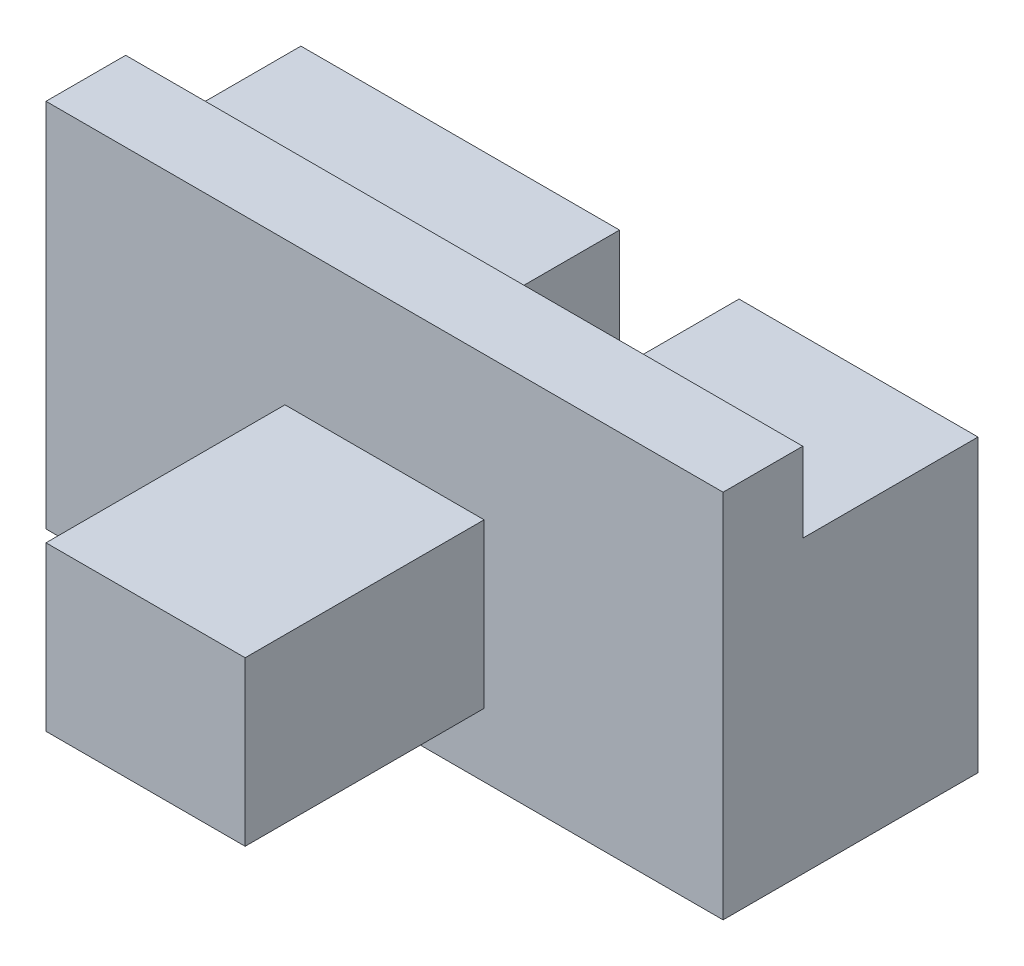
ISO-10303-21;
HEADER;
FILE_DESCRIPTION(('STEP AP214'),'2;1');
FILE_NAME('part.step','',(''),(''),'','','');
FILE_SCHEMA(('AUTOMOTIVE_DESIGN { 1 0 10303 214 1 1 1 1 }'));
ENDSEC;
DATA;
#1=APPLICATION_CONTEXT('core data for automotive mechanical design processes');
#2=APPLICATION_PROTOCOL_DEFINITION('international standard','automotive_design',2000,#1);
#3=PRODUCT_CONTEXT('',#1,'mechanical');
#4=PRODUCT('Part','Part','',(#3));
#5=PRODUCT_RELATED_PRODUCT_CATEGORY('part','',(#4));
#6=PRODUCT_DEFINITION_FORMATION('','',#4);
#7=PRODUCT_DEFINITION_CONTEXT('part definition',#1,'design');
#8=PRODUCT_DEFINITION('design','',#6,#7);
#9=PRODUCT_DEFINITION_SHAPE('','',#8);
#10=(LENGTH_UNIT() NAMED_UNIT(*) SI_UNIT(.MILLI.,.METRE.));
#11=(NAMED_UNIT(*) PLANE_ANGLE_UNIT() SI_UNIT($,.RADIAN.));
#12=(NAMED_UNIT(*) SI_UNIT($,.STERADIAN.) SOLID_ANGLE_UNIT());
#13=UNCERTAINTY_MEASURE_WITH_UNIT(LENGTH_MEASURE(1.E-05),#10,'distance_accuracy_value','');
#14=(GEOMETRIC_REPRESENTATION_CONTEXT(3) GLOBAL_UNCERTAINTY_ASSIGNED_CONTEXT((#13)) GLOBAL_UNIT_ASSIGNED_CONTEXT((#10,
#11,#12)) REPRESENTATION_CONTEXT('',''));
#15=CARTESIAN_POINT('',(0.,0.,0.));
#16=DIRECTION('',(0.,0.,1.));
#17=DIRECTION('',(1.,0.,0.));
#18=AXIS2_PLACEMENT_3D('',#15,#16,#17);
#19=CARTESIAN_POINT('',(-4.25,1.825,1.));
#20=DIRECTION('',(0.,-1.,0.));
#21=DIRECTION('',(1.,0.,0.));
#22=AXIS2_PLACEMENT_3D('',#19,#20,#21);
#23=PLANE('',#22);
#24=DIRECTION('',(-1.,0.,0.));
#25=VECTOR('',#24,1.);
#26=CARTESIAN_POINT('',(-4.25,1.825,0.));
#27=LINE('',#26,#25);
#28=CARTESIAN_POINT('',(4.25,1.825,0.));
#29=VERTEX_POINT('',#28);
#30=CARTESIAN_POINT('',(1.25,1.825,0.));
#31=VERTEX_POINT('',#30);
#32=EDGE_CURVE('E43',#29,#31,#27,.T.);
#33=ORIENTED_EDGE('',*,*,#32,.F.);
#34=DIRECTION('',(0.,0.,-1.));
#35=VECTOR('',#34,1.);
#36=CARTESIAN_POINT('',(4.25,1.825,1.));
#37=LINE('',#36,#35);
#38=CARTESIAN_POINT('',(4.25,1.825,-2.2));
#39=VERTEX_POINT('',#38);
#40=EDGE_CURVE('E37',#29,#39,#37,.T.);
#41=ORIENTED_EDGE('',*,*,#40,.T.);
#42=DIRECTION('',(1.,0.,0.));
#43=VECTOR('',#42,1.);
#44=CARTESIAN_POINT('',(4.25,1.825,-2.2));
#45=LINE('',#44,#43);
#46=CARTESIAN_POINT('',(1.25,1.825,-2.2));
#47=VERTEX_POINT('',#46);
#48=EDGE_CURVE('E178',#47,#39,#45,.T.);
#49=ORIENTED_EDGE('',*,*,#48,.F.);
#50=DIRECTION('',(0.,0.,1.));
#51=VECTOR('',#50,1.);
#52=CARTESIAN_POINT('',(1.25,1.825,-2.2));
#53=LINE('',#52,#51);
#54=EDGE_CURVE('E54',#47,#31,#53,.T.);
#55=ORIENTED_EDGE('',*,*,#54,.T.);
#56=EDGE_LOOP('',(#33,#41,#49,#55));
#57=FACE_BOUND('',#56,.T.);
#58=ADVANCED_FACE('F33',(#57),#23,.F.);
#59=CARTESIAN_POINT('',(-0.25,1.825,0.));
#60=VERTEX_POINT('',#59);
#61=CARTESIAN_POINT('',(-4.25,1.825,0.));
#62=VERTEX_POINT('',#61);
#63=EDGE_CURVE('E11',#60,#62,#27,.T.);
#64=ORIENTED_EDGE('',*,*,#63,.F.);
#65=DIRECTION('',(0.,0.,1.));
#66=VECTOR('',#65,1.);
#67=CARTESIAN_POINT('',(-0.25,1.825,-2.2));
#68=LINE('',#67,#66);
#69=CARTESIAN_POINT('',(-0.25,1.825,-2.2));
#70=VERTEX_POINT('',#69);
#71=EDGE_CURVE('E201',#70,#60,#68,.T.);
#72=ORIENTED_EDGE('',*,*,#71,.F.);
#73=DIRECTION('',(1.,0.,0.));
#74=VECTOR('',#73,1.);
#75=CARTESIAN_POINT('',(-4.25,1.825,-2.2));
#76=LINE('',#75,#74);
#77=CARTESIAN_POINT('',(-4.25,1.825,-2.2));
#78=VERTEX_POINT('',#77);
#79=EDGE_CURVE('E189',#78,#70,#76,.T.);
#80=ORIENTED_EDGE('',*,*,#79,.F.);
#81=DIRECTION('',(0.,0.,-1.));
#82=VECTOR('',#81,1.);
#83=CARTESIAN_POINT('',(-4.25,1.825,1.));
#84=LINE('',#83,#82);
#85=EDGE_CURVE('E244',#62,#78,#84,.T.);
#86=ORIENTED_EDGE('',*,*,#85,.F.);
#87=EDGE_LOOP('',(#64,#72,#80,#86));
#88=FACE_BOUND('',#87,.T.);
#89=ADVANCED_FACE('F265',(#88),#23,.F.);
#90=CARTESIAN_POINT('',(0.,0.,0.));
#91=DIRECTION('',(0.,0.,-1.));
#92=DIRECTION('',(-1.,0.,0.));
#93=AXIS2_PLACEMENT_3D('',#90,#91,#92);
#94=PLANE('',#93);
#95=DIRECTION('',(0.,-1.,0.));
#96=VECTOR('',#95,1.);
#97=CARTESIAN_POINT('',(-0.25,-1.825,0.));
#98=LINE('',#97,#96);
#99=CARTESIAN_POINT('',(-0.25,-1.825,0.));
#100=VERTEX_POINT('',#99);
#101=EDGE_CURVE('E185',#60,#100,#98,.T.);
#102=ORIENTED_EDGE('',*,*,#101,.F.);
#103=ORIENTED_EDGE('',*,*,#63,.T.);
#104=DIRECTION('',(0.,-1.,0.));
#105=VECTOR('',#104,1.);
#106=CARTESIAN_POINT('',(-4.25,2.825,0.));
#107=LINE('',#106,#105);
#108=CARTESIAN_POINT('',(-4.25,2.825,0.));
#109=VERTEX_POINT('',#108);
#110=EDGE_CURVE('E164',#109,#62,#107,.T.);
#111=ORIENTED_EDGE('',*,*,#110,.F.);
#112=DIRECTION('',(-1.,0.,0.));
#113=VECTOR('',#112,1.);
#114=CARTESIAN_POINT('',(-4.25,2.825,0.));
#115=LINE('',#114,#113);
#116=CARTESIAN_POINT('',(4.25,2.825,0.));
#117=VERTEX_POINT('',#116);
#118=EDGE_CURVE('E159',#117,#109,#115,.T.);
#119=ORIENTED_EDGE('',*,*,#118,.F.);
#120=DIRECTION('',(0.,-1.,0.));
#121=VECTOR('',#120,1.);
#122=CARTESIAN_POINT('',(4.25,2.825,0.));
#123=LINE('',#122,#121);
#124=EDGE_CURVE('E167',#117,#29,#123,.T.);
#125=ORIENTED_EDGE('',*,*,#124,.T.);
#126=ORIENTED_EDGE('',*,*,#32,.T.);
#127=DIRECTION('',(0.,1.,0.));
#128=VECTOR('',#127,1.);
#129=CARTESIAN_POINT('',(1.25,-1.825,0.));
#130=LINE('',#129,#128);
#131=CARTESIAN_POINT('',(1.25,-1.825,0.));
#132=VERTEX_POINT('',#131);
#133=EDGE_CURVE('E170',#132,#31,#130,.T.);
#134=ORIENTED_EDGE('',*,*,#133,.F.);
#135=DIRECTION('',(1.,0.,0.));
#136=VECTOR('',#135,1.);
#137=CARTESIAN_POINT('',(-4.25,-1.825,0.));
#138=LINE('',#137,#136);
#139=EDGE_CURVE('E237',#100,#132,#138,.T.);
#140=ORIENTED_EDGE('',*,*,#139,.F.);
#141=EDGE_LOOP('',(#102,#103,#111,#119,#125,#126,#134,#140));
#142=FACE_BOUND('',#141,.T.);
#143=ADVANCED_FACE('F262',(#142),#94,.T.);
#144=CARTESIAN_POINT('',(0.,0.,1.));
#145=DIRECTION('',(0.,0.,-1.));
#146=DIRECTION('',(-1.,0.,0.));
#147=AXIS2_PLACEMENT_3D('',#144,#145,#146);
#148=PLANE('',#147);
#149=DIRECTION('',(0.,1.,0.));
#150=VECTOR('',#149,1.);
#151=CARTESIAN_POINT('',(4.25,-1.825,1.));
#152=LINE('',#151,#150);
#153=CARTESIAN_POINT('',(4.25,-1.825,1.));
#154=VERTEX_POINT('',#153);
#155=CARTESIAN_POINT('',(4.25,2.825,1.));
#156=VERTEX_POINT('',#155);
#157=EDGE_CURVE('E146',#154,#156,#152,.T.);
#158=ORIENTED_EDGE('',*,*,#157,.T.);
#159=DIRECTION('',(1.,0.,0.));
#160=VECTOR('',#159,1.);
#161=CARTESIAN_POINT('',(-4.25,2.825,1.));
#162=LINE('',#161,#160);
#163=CARTESIAN_POINT('',(-4.25,2.825,1.));
#164=VERTEX_POINT('',#163);
#165=EDGE_CURVE('E149',#164,#156,#162,.T.);
#166=ORIENTED_EDGE('',*,*,#165,.F.);
#167=DIRECTION('',(0.,-1.,0.));
#168=VECTOR('',#167,1.);
#169=CARTESIAN_POINT('',(-4.25,-1.825,1.));
#170=LINE('',#169,#168);
#171=CARTESIAN_POINT('',(-4.25,-1.825,1.));
#172=VERTEX_POINT('',#171);
#173=EDGE_CURVE('E135',#164,#172,#170,.T.);
#174=ORIENTED_EDGE('',*,*,#173,.T.);
#175=DIRECTION('',(1.,0.,0.));
#176=VECTOR('',#175,1.);
#177=CARTESIAN_POINT('',(-4.25,-1.825,1.));
#178=LINE('',#177,#176);
#179=EDGE_CURVE('E145',#172,#154,#178,.T.);
#180=ORIENTED_EDGE('',*,*,#179,.T.);
#181=EDGE_LOOP('',(#158,#166,#174,#180));
#182=FACE_BOUND('',#181,.T.);
#183=DIRECTION('',(0.,-1.,0.));
#184=VECTOR('',#183,1.);
#185=CARTESIAN_POINT('',(-1.25,-1.025,1.));
#186=LINE('',#185,#184);
#187=CARTESIAN_POINT('',(-1.25,1.025,1.));
#188=VERTEX_POINT('',#187);
#189=CARTESIAN_POINT('',(-1.25,-1.025,1.));
#190=VERTEX_POINT('',#189);
#191=EDGE_CURVE('E204',#188,#190,#186,.T.);
#192=ORIENTED_EDGE('',*,*,#191,.F.);
#193=DIRECTION('',(-1.,0.,0.));
#194=VECTOR('',#193,1.);
#195=CARTESIAN_POINT('',(-1.25,1.025,1.));
#196=LINE('',#195,#194);
#197=CARTESIAN_POINT('',(1.25,1.025,1.));
#198=VERTEX_POINT('',#197);
#199=EDGE_CURVE('E209',#198,#188,#196,.T.);
#200=ORIENTED_EDGE('',*,*,#199,.F.);
#201=DIRECTION('',(0.,1.,0.));
#202=VECTOR('',#201,1.);
#203=CARTESIAN_POINT('',(1.25,-1.025,1.));
#204=LINE('',#203,#202);
#205=CARTESIAN_POINT('',(1.25,-1.025,1.));
#206=VERTEX_POINT('',#205);
#207=EDGE_CURVE('E221',#206,#198,#204,.T.);
#208=ORIENTED_EDGE('',*,*,#207,.F.);
#209=DIRECTION('',(1.,0.,0.));
#210=VECTOR('',#209,1.);
#211=CARTESIAN_POINT('',(-1.25,-1.025,1.));
#212=LINE('',#211,#210);
#213=EDGE_CURVE('E218',#190,#206,#212,.T.);
#214=ORIENTED_EDGE('',*,*,#213,.F.);
#215=EDGE_LOOP('',(#192,#200,#208,#214));
#216=FACE_BOUND('',#215,.T.);
#217=ADVANCED_FACE('F150',(#182,#216),#148,.F.);
#218=CARTESIAN_POINT('',(4.25,-1.825,1.));
#219=DIRECTION('',(-1.,0.,0.));
#220=DIRECTION('',(0.,0.,1.));
#221=AXIS2_PLACEMENT_3D('',#218,#219,#220);
#222=PLANE('',#221);
#223=DIRECTION('',(0.,0.,-1.));
#224=VECTOR('',#223,1.);
#225=CARTESIAN_POINT('',(4.25,-1.825,1.));
#226=LINE('',#225,#224);
#227=CARTESIAN_POINT('',(4.25,-1.825,-2.2));
#228=VERTEX_POINT('',#227);
#229=EDGE_CURVE('E240',#154,#228,#226,.T.);
#230=ORIENTED_EDGE('',*,*,#229,.T.);
#231=DIRECTION('',(0.,-1.,0.));
#232=VECTOR('',#231,1.);
#233=CARTESIAN_POINT('',(4.25,-1.825,-2.2));
#234=LINE('',#233,#232);
#235=EDGE_CURVE('E171',#39,#228,#234,.T.);
#236=ORIENTED_EDGE('',*,*,#235,.F.);
#237=ORIENTED_EDGE('',*,*,#40,.F.);
#238=ORIENTED_EDGE('',*,*,#124,.F.);
#239=DIRECTION('',(0.,0.,-1.));
#240=VECTOR('',#239,1.);
#241=CARTESIAN_POINT('',(4.25,2.825,1.));
#242=LINE('',#241,#240);
#243=EDGE_CURVE('E155',#156,#117,#242,.T.);
#244=ORIENTED_EDGE('',*,*,#243,.F.);
#245=ORIENTED_EDGE('',*,*,#157,.F.);
#246=EDGE_LOOP('',(#230,#236,#237,#238,#244,#245));
#247=FACE_BOUND('',#246,.T.);
#248=ADVANCED_FACE('F35',(#247),#222,.F.);
#249=CARTESIAN_POINT('',(-4.25,-1.825,1.));
#250=DIRECTION('',(1.,0.,0.));
#251=DIRECTION('',(0.,0.,-1.));
#252=AXIS2_PLACEMENT_3D('',#249,#250,#251);
#253=PLANE('',#252);
#254=ORIENTED_EDGE('',*,*,#173,.F.);
#255=DIRECTION('',(0.,0.,1.));
#256=VECTOR('',#255,1.);
#257=CARTESIAN_POINT('',(-4.25,2.825,1.));
#258=LINE('',#257,#256);
#259=EDGE_CURVE('E140',#109,#164,#258,.T.);
#260=ORIENTED_EDGE('',*,*,#259,.F.);
#261=ORIENTED_EDGE('',*,*,#110,.T.);
#262=ORIENTED_EDGE('',*,*,#85,.T.);
#263=DIRECTION('',(0.,1.,0.));
#264=VECTOR('',#263,1.);
#265=CARTESIAN_POINT('',(-4.25,-1.825,-2.2));
#266=LINE('',#265,#264);
#267=CARTESIAN_POINT('',(-4.25,-1.825,-2.2));
#268=VERTEX_POINT('',#267);
#269=EDGE_CURVE('E186',#268,#78,#266,.T.);
#270=ORIENTED_EDGE('',*,*,#269,.F.);
#271=DIRECTION('',(0.,0.,-1.));
#272=VECTOR('',#271,1.);
#273=CARTESIAN_POINT('',(-4.25,-1.825,1.));
#274=LINE('',#273,#272);
#275=EDGE_CURVE('E142',#172,#268,#274,.T.);
#276=ORIENTED_EDGE('',*,*,#275,.F.);
#277=EDGE_LOOP('',(#254,#260,#261,#262,#270,#276));
#278=FACE_BOUND('',#277,.T.);
#279=ADVANCED_FACE('F137',(#278),#253,.F.);
#280=CARTESIAN_POINT('',(-4.25,-1.825,1.));
#281=DIRECTION('',(0.,1.,0.));
#282=DIRECTION('',(-1.,0.,0.));
#283=AXIS2_PLACEMENT_3D('',#280,#281,#282);
#284=PLANE('',#283);
#285=ORIENTED_EDGE('',*,*,#275,.T.);
#286=DIRECTION('',(-1.,0.,0.));
#287=VECTOR('',#286,1.);
#288=CARTESIAN_POINT('',(-4.25,-1.825,-2.2));
#289=LINE('',#288,#287);
#290=CARTESIAN_POINT('',(-0.25,-1.825,-2.2));
#291=VERTEX_POINT('',#290);
#292=EDGE_CURVE('E193',#291,#268,#289,.T.);
#293=ORIENTED_EDGE('',*,*,#292,.F.);
#294=DIRECTION('',(0.,0.,1.));
#295=VECTOR('',#294,1.);
#296=CARTESIAN_POINT('',(-0.25,-1.825,-2.2));
#297=LINE('',#296,#295);
#298=EDGE_CURVE('E196',#291,#100,#297,.T.);
#299=ORIENTED_EDGE('',*,*,#298,.T.);
#300=ORIENTED_EDGE('',*,*,#139,.T.);
#301=DIRECTION('',(0.,0.,1.));
#302=VECTOR('',#301,1.);
#303=CARTESIAN_POINT('',(1.25,-1.825,-2.2));
#304=LINE('',#303,#302);
#305=CARTESIAN_POINT('',(1.25,-1.825,-2.2));
#306=VERTEX_POINT('',#305);
#307=EDGE_CURVE('E183',#306,#132,#304,.T.);
#308=ORIENTED_EDGE('',*,*,#307,.F.);
#309=DIRECTION('',(-1.,0.,0.));
#310=VECTOR('',#309,1.);
#311=CARTESIAN_POINT('',(4.25,-1.825,-2.2));
#312=LINE('',#311,#310);
#313=EDGE_CURVE('E174',#228,#306,#312,.T.);
#314=ORIENTED_EDGE('',*,*,#313,.F.);
#315=ORIENTED_EDGE('',*,*,#229,.F.);
#316=ORIENTED_EDGE('',*,*,#179,.F.);
#317=EDGE_LOOP('',(#285,#293,#299,#300,#308,#314,#315,#316));
#318=FACE_BOUND('',#317,.T.);
#319=ADVANCED_FACE('F256',(#318),#284,.F.);
#320=CARTESIAN_POINT('',(-1.25,-1.025,4.));
#321=DIRECTION('',(1.,0.,0.));
#322=DIRECTION('',(0.,0.,-1.));
#323=AXIS2_PLACEMENT_3D('',#320,#321,#322);
#324=PLANE('',#323);
#325=ORIENTED_EDGE('',*,*,#191,.T.);
#326=DIRECTION('',(0.,0.,-1.));
#327=VECTOR('',#326,1.);
#328=CARTESIAN_POINT('',(-1.25,-1.025,4.));
#329=LINE('',#328,#327);
#330=CARTESIAN_POINT('',(-1.25,-1.025,4.));
#331=VERTEX_POINT('',#330);
#332=EDGE_CURVE('E234',#331,#190,#329,.T.);
#333=ORIENTED_EDGE('',*,*,#332,.F.);
#334=DIRECTION('',(0.,-1.,0.));
#335=VECTOR('',#334,1.);
#336=CARTESIAN_POINT('',(-1.25,-1.025,4.));
#337=LINE('',#336,#335);
#338=CARTESIAN_POINT('',(-1.25,1.025,4.));
#339=VERTEX_POINT('',#338);
#340=EDGE_CURVE('E205',#339,#331,#337,.T.);
#341=ORIENTED_EDGE('',*,*,#340,.F.);
#342=DIRECTION('',(0.,0.,-1.));
#343=VECTOR('',#342,1.);
#344=CARTESIAN_POINT('',(-1.25,1.025,4.));
#345=LINE('',#344,#343);
#346=EDGE_CURVE('E215',#339,#188,#345,.T.);
#347=ORIENTED_EDGE('',*,*,#346,.T.);
#348=EDGE_LOOP('',(#325,#333,#341,#347));
#349=FACE_BOUND('',#348,.T.);
#350=ADVANCED_FACE('F296',(#349),#324,.F.);
#351=CARTESIAN_POINT('',(-1.25,-1.025,4.));
#352=DIRECTION('',(0.,1.,0.));
#353=DIRECTION('',(0.,0.,1.));
#354=AXIS2_PLACEMENT_3D('',#351,#352,#353);
#355=PLANE('',#354);
#356=ORIENTED_EDGE('',*,*,#213,.T.);
#357=DIRECTION('',(0.,0.,-1.));
#358=VECTOR('',#357,1.);
#359=CARTESIAN_POINT('',(1.25,-1.025,4.));
#360=LINE('',#359,#358);
#361=CARTESIAN_POINT('',(1.25,-1.025,4.));
#362=VERTEX_POINT('',#361);
#363=EDGE_CURVE('E231',#362,#206,#360,.T.);
#364=ORIENTED_EDGE('',*,*,#363,.F.);
#365=DIRECTION('',(1.,0.,0.));
#366=VECTOR('',#365,1.);
#367=CARTESIAN_POINT('',(-1.25,-1.025,4.));
#368=LINE('',#367,#366);
#369=EDGE_CURVE('E208',#331,#362,#368,.T.);
#370=ORIENTED_EDGE('',*,*,#369,.F.);
#371=ORIENTED_EDGE('',*,*,#332,.T.);
#372=EDGE_LOOP('',(#356,#364,#370,#371));
#373=FACE_BOUND('',#372,.T.);
#374=ADVANCED_FACE('F303',(#373),#355,.F.);
#375=CARTESIAN_POINT('',(1.25,-1.025,4.));
#376=DIRECTION('',(-1.,0.,0.));
#377=DIRECTION('',(0.,0.,1.));
#378=AXIS2_PLACEMENT_3D('',#375,#376,#377);
#379=PLANE('',#378);
#380=ORIENTED_EDGE('',*,*,#207,.T.);
#381=DIRECTION('',(0.,0.,-1.));
#382=VECTOR('',#381,1.);
#383=CARTESIAN_POINT('',(1.25,1.025,4.));
#384=LINE('',#383,#382);
#385=CARTESIAN_POINT('',(1.25,1.025,4.));
#386=VERTEX_POINT('',#385);
#387=EDGE_CURVE('E228',#386,#198,#384,.T.);
#388=ORIENTED_EDGE('',*,*,#387,.F.);
#389=DIRECTION('',(0.,1.,0.));
#390=VECTOR('',#389,1.);
#391=CARTESIAN_POINT('',(1.25,-1.025,4.));
#392=LINE('',#391,#390);
#393=EDGE_CURVE('E211',#362,#386,#392,.T.);
#394=ORIENTED_EDGE('',*,*,#393,.F.);
#395=ORIENTED_EDGE('',*,*,#363,.T.);
#396=EDGE_LOOP('',(#380,#388,#394,#395));
#397=FACE_BOUND('',#396,.T.);
#398=ADVANCED_FACE('F307',(#397),#379,.F.);
#399=CARTESIAN_POINT('',(-1.25,1.025,4.));
#400=DIRECTION('',(0.,-1.,0.));
#401=DIRECTION('',(0.,0.,-1.));
#402=AXIS2_PLACEMENT_3D('',#399,#400,#401);
#403=PLANE('',#402);
#404=ORIENTED_EDGE('',*,*,#199,.T.);
#405=ORIENTED_EDGE('',*,*,#346,.F.);
#406=DIRECTION('',(-1.,0.,0.));
#407=VECTOR('',#406,1.);
#408=CARTESIAN_POINT('',(-1.25,1.025,4.));
#409=LINE('',#408,#407);
#410=EDGE_CURVE('E213',#386,#339,#409,.T.);
#411=ORIENTED_EDGE('',*,*,#410,.F.);
#412=ORIENTED_EDGE('',*,*,#387,.T.);
#413=EDGE_LOOP('',(#404,#405,#411,#412));
#414=FACE_BOUND('',#413,.T.);
#415=ADVANCED_FACE('F283',(#414),#403,.F.);
#416=CARTESIAN_POINT('',(0.,0.,4.));
#417=DIRECTION('',(0.,0.,-1.));
#418=DIRECTION('',(-1.,0.,0.));
#419=AXIS2_PLACEMENT_3D('',#416,#417,#418);
#420=PLANE('',#419);
#421=ORIENTED_EDGE('',*,*,#340,.T.);
#422=ORIENTED_EDGE('',*,*,#369,.T.);
#423=ORIENTED_EDGE('',*,*,#393,.T.);
#424=ORIENTED_EDGE('',*,*,#410,.T.);
#425=EDGE_LOOP('',(#421,#422,#423,#424));
#426=FACE_BOUND('',#425,.T.);
#427=ADVANCED_FACE('F274',(#426),#420,.F.);
#428=CARTESIAN_POINT('',(-0.25,-1.825,-2.2));
#429=DIRECTION('',(-1.,0.,0.));
#430=DIRECTION('',(0.,0.,1.));
#431=AXIS2_PLACEMENT_3D('',#428,#429,#430);
#432=PLANE('',#431);
#433=ORIENTED_EDGE('',*,*,#101,.T.);
#434=ORIENTED_EDGE('',*,*,#298,.F.);
#435=DIRECTION('',(0.,-1.,0.));
#436=VECTOR('',#435,1.);
#437=CARTESIAN_POINT('',(-0.25,-1.825,-2.2));
#438=LINE('',#437,#436);
#439=EDGE_CURVE('E191',#70,#291,#438,.T.);
#440=ORIENTED_EDGE('',*,*,#439,.F.);
#441=ORIENTED_EDGE('',*,*,#71,.T.);
#442=EDGE_LOOP('',(#433,#434,#440,#441));
#443=FACE_BOUND('',#442,.T.);
#444=ADVANCED_FACE('F272',(#443),#432,.F.);
#445=CARTESIAN_POINT('',(0.,0.,-2.2));
#446=DIRECTION('',(0.,0.,-1.));
#447=DIRECTION('',(-1.,0.,0.));
#448=AXIS2_PLACEMENT_3D('',#445,#446,#447);
#449=PLANE('',#448);
#450=ORIENTED_EDGE('',*,*,#269,.T.);
#451=ORIENTED_EDGE('',*,*,#79,.T.);
#452=ORIENTED_EDGE('',*,*,#439,.T.);
#453=ORIENTED_EDGE('',*,*,#292,.T.);
#454=EDGE_LOOP('',(#450,#451,#452,#453));
#455=FACE_BOUND('',#454,.T.);
#456=ADVANCED_FACE('F268',(#455),#449,.T.);
#457=CARTESIAN_POINT('',(1.25,-1.825,-2.2));
#458=DIRECTION('',(1.,0.,0.));
#459=DIRECTION('',(0.,0.,-1.));
#460=AXIS2_PLACEMENT_3D('',#457,#458,#459);
#461=PLANE('',#460);
#462=ORIENTED_EDGE('',*,*,#133,.T.);
#463=ORIENTED_EDGE('',*,*,#54,.F.);
#464=DIRECTION('',(0.,1.,0.));
#465=VECTOR('',#464,1.);
#466=CARTESIAN_POINT('',(1.25,-1.825,-2.2));
#467=LINE('',#466,#465);
#468=EDGE_CURVE('E176',#306,#47,#467,.T.);
#469=ORIENTED_EDGE('',*,*,#468,.F.);
#470=ORIENTED_EDGE('',*,*,#307,.T.);
#471=EDGE_LOOP('',(#462,#463,#469,#470));
#472=FACE_BOUND('',#471,.T.);
#473=ADVANCED_FACE('F259',(#472),#461,.F.);
#474=CARTESIAN_POINT('',(0.,0.,-2.2));
#475=DIRECTION('',(0.,0.,1.));
#476=DIRECTION('',(1.,0.,0.));
#477=AXIS2_PLACEMENT_3D('',#474,#475,#476);
#478=PLANE('',#477);
#479=ORIENTED_EDGE('',*,*,#235,.T.);
#480=ORIENTED_EDGE('',*,*,#313,.T.);
#481=ORIENTED_EDGE('',*,*,#468,.T.);
#482=ORIENTED_EDGE('',*,*,#48,.T.);
#483=EDGE_LOOP('',(#479,#480,#481,#482));
#484=FACE_BOUND('',#483,.T.);
#485=ADVANCED_FACE('F250',(#484),#478,.F.);
#486=CARTESIAN_POINT('',(0.,2.825,0.));
#487=DIRECTION('',(0.,-1.,0.));
#488=DIRECTION('',(1.,0.,0.));
#489=AXIS2_PLACEMENT_3D('',#486,#487,#488);
#490=PLANE('',#489);
#491=ORIENTED_EDGE('',*,*,#259,.T.);
#492=ORIENTED_EDGE('',*,*,#165,.T.);
#493=ORIENTED_EDGE('',*,*,#243,.T.);
#494=ORIENTED_EDGE('',*,*,#118,.T.);
#495=EDGE_LOOP('',(#491,#492,#493,#494));
#496=FACE_BOUND('',#495,.T.);
#497=ADVANCED_FACE('F157',(#496),#490,.F.);
#498=CLOSED_SHELL('',(#58,#89,#143,#217,#248,#279,#319,#350,#374,#398,#415,#427,#444,#456,#473,
#485,#497));
#499=MANIFOLD_SOLID_BREP('B2',#498);
#500=ADVANCED_BREP_SHAPE_REPRESENTATION('',(#18,#499),#14);
#501=SHAPE_DEFINITION_REPRESENTATION(#9,#500);
ENDSEC;
END-ISO-10303-21;
